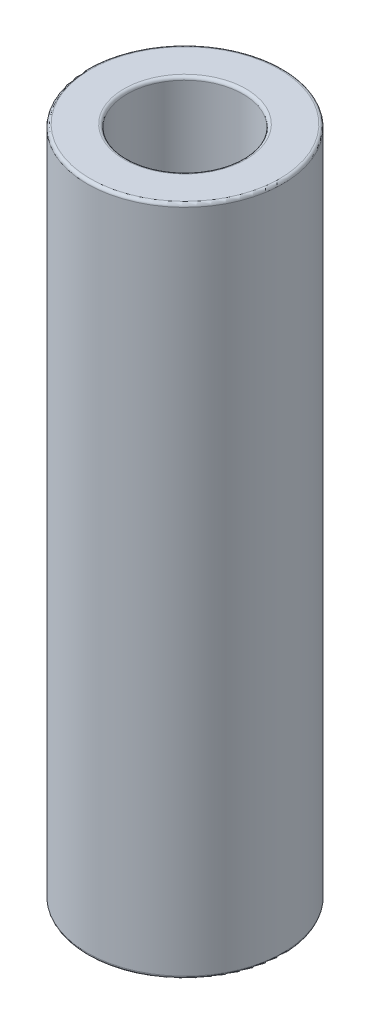
ISO-10303-21;
HEADER;
FILE_DESCRIPTION(('STEP AP214'),'2;1');
FILE_NAME('part.step','',(''),(''),'','','');
FILE_SCHEMA(('AUTOMOTIVE_DESIGN { 1 0 10303 214 1 1 1 1 }'));
ENDSEC;
DATA;
#1=APPLICATION_CONTEXT('core data for automotive mechanical design processes');
#2=APPLICATION_PROTOCOL_DEFINITION('international standard','automotive_design',2000,#1);
#3=PRODUCT_CONTEXT('',#1,'mechanical');
#4=PRODUCT('Part','Part','',(#3));
#5=PRODUCT_RELATED_PRODUCT_CATEGORY('part','',(#4));
#6=PRODUCT_DEFINITION_FORMATION('','',#4);
#7=PRODUCT_DEFINITION_CONTEXT('part definition',#1,'design');
#8=PRODUCT_DEFINITION('design','',#6,#7);
#9=PRODUCT_DEFINITION_SHAPE('','',#8);
#10=(LENGTH_UNIT() NAMED_UNIT(*) SI_UNIT(.MILLI.,.METRE.));
#11=(NAMED_UNIT(*) PLANE_ANGLE_UNIT() SI_UNIT($,.RADIAN.));
#12=(NAMED_UNIT(*) SI_UNIT($,.STERADIAN.) SOLID_ANGLE_UNIT());
#13=UNCERTAINTY_MEASURE_WITH_UNIT(LENGTH_MEASURE(1.E-05),#10,'distance_accuracy_value','');
#14=(GEOMETRIC_REPRESENTATION_CONTEXT(3) GLOBAL_UNCERTAINTY_ASSIGNED_CONTEXT((#13)) GLOBAL_UNIT_ASSIGNED_CONTEXT((#10,
#11,#12)) REPRESENTATION_CONTEXT('',''));
#15=CARTESIAN_POINT('',(0.,0.,0.));
#16=DIRECTION('',(0.,0.,1.));
#17=DIRECTION('',(1.,0.,0.));
#18=AXIS2_PLACEMENT_3D('',#15,#16,#17);
#19=CARTESIAN_POINT('',(0.,110.,0.));
#20=DIRECTION('',(0.,-1.,0.));
#21=DIRECTION('',(0.,0.,-1.));
#22=AXIS2_PLACEMENT_3D('',#19,#20,#21);
#23=CYLINDRICAL_SURFACE('',#22,9.5);
#24=CARTESIAN_POINT('',(0.,109.5,0.));
#25=DIRECTION('',(0.,1.,0.));
#26=DIRECTION('',(0.,0.,1.));
#27=AXIS2_PLACEMENT_3D('',#24,#25,#26);
#28=CIRCLE('',#27,9.5);
#29=CARTESIAN_POINT('',(0.,109.5,9.5));
#30=VERTEX_POINT('',#29);
#31=EDGE_CURVE('E48',#30,#30,#28,.T.);
#32=ORIENTED_EDGE('',*,*,#31,.T.);
#33=EDGE_LOOP('',(#32));
#34=FACE_BOUND('',#33,.T.);
#35=CARTESIAN_POINT('',(0.,0.5,0.));
#36=DIRECTION('',(0.,1.,0.));
#37=DIRECTION('',(0.,0.,1.));
#38=AXIS2_PLACEMENT_3D('',#35,#36,#37);
#39=CIRCLE('',#38,9.5);
#40=CARTESIAN_POINT('',(0.,0.5,9.5));
#41=VERTEX_POINT('',#40);
#42=EDGE_CURVE('E52',#41,#41,#39,.F.);
#43=ORIENTED_EDGE('',*,*,#42,.T.);
#44=EDGE_LOOP('',(#43));
#45=FACE_BOUND('',#44,.T.);
#46=ADVANCED_FACE('F37',(#34,#45),#23,.F.);
#47=CARTESIAN_POINT('',(0.,110.,0.));
#48=DIRECTION('',(0.,-1.,0.));
#49=DIRECTION('',(0.,0.,-1.));
#50=AXIS2_PLACEMENT_3D('',#47,#48,#49);
#51=CYLINDRICAL_SURFACE('',#50,16.);
#52=CARTESIAN_POINT('',(0.,109.5,0.));
#53=DIRECTION('',(0.,1.,0.));
#54=DIRECTION('',(0.,0.,1.));
#55=AXIS2_PLACEMENT_3D('',#52,#53,#54);
#56=CIRCLE('',#55,16.);
#57=CARTESIAN_POINT('',(0.,109.5,16.));
#58=VERTEX_POINT('',#57);
#59=EDGE_CURVE('E57',#58,#58,#56,.F.);
#60=ORIENTED_EDGE('',*,*,#59,.T.);
#61=EDGE_LOOP('',(#60));
#62=FACE_BOUND('',#61,.T.);
#63=CARTESIAN_POINT('',(0.,0.5,0.));
#64=DIRECTION('',(0.,1.,0.));
#65=DIRECTION('',(0.,0.,1.));
#66=AXIS2_PLACEMENT_3D('',#63,#64,#65);
#67=CIRCLE('',#66,16.);
#68=CARTESIAN_POINT('',(0.,0.5,16.));
#69=VERTEX_POINT('',#68);
#70=EDGE_CURVE('E60',#69,#69,#67,.T.);
#71=ORIENTED_EDGE('',*,*,#70,.T.);
#72=EDGE_LOOP('',(#71));
#73=FACE_BOUND('',#72,.T.);
#74=ADVANCED_FACE('F82',(#62,#73),#51,.T.);
#75=CARTESIAN_POINT('',(0.,110.,0.));
#76=DIRECTION('',(0.,1.,0.));
#77=DIRECTION('',(0.,0.,1.));
#78=AXIS2_PLACEMENT_3D('',#75,#76,#77);
#79=PLANE('',#78);
#80=CARTESIAN_POINT('',(0.,110.,0.));
#81=DIRECTION('',(0.,1.,0.));
#82=DIRECTION('',(0.,0.,1.));
#83=AXIS2_PLACEMENT_3D('',#80,#81,#82);
#84=CIRCLE('',#83,15.5);
#85=CARTESIAN_POINT('',(0.,110.,15.5));
#86=VERTEX_POINT('',#85);
#87=EDGE_CURVE('E63',#86,#86,#84,.T.);
#88=ORIENTED_EDGE('',*,*,#87,.T.);
#89=EDGE_LOOP('',(#88));
#90=FACE_BOUND('',#89,.T.);
#91=CARTESIAN_POINT('',(0.,110.,0.));
#92=DIRECTION('',(0.,1.,0.));
#93=DIRECTION('',(0.,0.,1.));
#94=AXIS2_PLACEMENT_3D('',#91,#92,#93);
#95=CIRCLE('',#94,10.);
#96=CARTESIAN_POINT('',(0.,110.,10.));
#97=VERTEX_POINT('',#96);
#98=EDGE_CURVE('E66',#97,#97,#95,.F.);
#99=ORIENTED_EDGE('',*,*,#98,.T.);
#100=EDGE_LOOP('',(#99));
#101=FACE_BOUND('',#100,.T.);
#102=ADVANCED_FACE('F70',(#90,#101),#79,.T.);
#103=CARTESIAN_POINT('',(0.,0.,0.));
#104=DIRECTION('',(0.,1.,0.));
#105=DIRECTION('',(0.,0.,1.));
#106=AXIS2_PLACEMENT_3D('',#103,#104,#105);
#107=PLANE('',#106);
#108=CARTESIAN_POINT('',(0.,0.,0.));
#109=DIRECTION('',(0.,1.,0.));
#110=DIRECTION('',(0.,0.,1.));
#111=AXIS2_PLACEMENT_3D('',#108,#109,#110);
#112=CIRCLE('',#111,15.5);
#113=CARTESIAN_POINT('',(0.,0.,15.5));
#114=VERTEX_POINT('',#113);
#115=EDGE_CURVE('E10',#114,#114,#112,.F.);
#116=ORIENTED_EDGE('',*,*,#115,.T.);
#117=EDGE_LOOP('',(#116));
#118=FACE_BOUND('',#117,.T.);
#119=CARTESIAN_POINT('',(0.,0.,0.));
#120=DIRECTION('',(0.,1.,0.));
#121=DIRECTION('',(0.,0.,1.));
#122=AXIS2_PLACEMENT_3D('',#119,#120,#121);
#123=CIRCLE('',#122,10.);
#124=CARTESIAN_POINT('',(0.,0.,10.));
#125=VERTEX_POINT('',#124);
#126=EDGE_CURVE('E44',#125,#125,#123,.T.);
#127=ORIENTED_EDGE('',*,*,#126,.T.);
#128=EDGE_LOOP('',(#127));
#129=FACE_BOUND('',#128,.T.);
#130=ADVANCED_FACE('F97',(#118,#129),#107,.F.);
#131=CARTESIAN_POINT('',(0.,109.5,0.));
#132=DIRECTION('',(0.,1.,0.));
#133=DIRECTION('',(0.,0.,1.));
#134=AXIS2_PLACEMENT_3D('',#131,#132,#133);
#135=TOROIDAL_SURFACE('',#134,15.5,0.5);
#136=ORIENTED_EDGE('',*,*,#59,.F.);
#137=EDGE_LOOP('',(#136));
#138=FACE_BOUND('',#137,.T.);
#139=ORIENTED_EDGE('',*,*,#87,.F.);
#140=EDGE_LOOP('',(#139));
#141=FACE_BOUND('',#140,.T.);
#142=ADVANCED_FACE('F76',(#138,#141),#135,.T.);
#143=CARTESIAN_POINT('',(0.,109.5,0.));
#144=DIRECTION('',(0.,1.,0.));
#145=DIRECTION('',(0.,0.,1.));
#146=AXIS2_PLACEMENT_3D('',#143,#144,#145);
#147=TOROIDAL_SURFACE('',#146,10.,0.5);
#148=ORIENTED_EDGE('',*,*,#98,.F.);
#149=EDGE_LOOP('',(#148));
#150=FACE_BOUND('',#149,.T.);
#151=ORIENTED_EDGE('',*,*,#31,.F.);
#152=EDGE_LOOP('',(#151));
#153=FACE_BOUND('',#152,.T.);
#154=ADVANCED_FACE('F72',(#150,#153),#147,.T.);
#155=CARTESIAN_POINT('',(0.,0.5,0.));
#156=DIRECTION('',(0.,1.,0.));
#157=DIRECTION('',(0.,0.,1.));
#158=AXIS2_PLACEMENT_3D('',#155,#156,#157);
#159=TOROIDAL_SURFACE('',#158,15.5,0.5);
#160=ORIENTED_EDGE('',*,*,#115,.F.);
#161=EDGE_LOOP('',(#160));
#162=FACE_BOUND('',#161,.T.);
#163=ORIENTED_EDGE('',*,*,#70,.F.);
#164=EDGE_LOOP('',(#163));
#165=FACE_BOUND('',#164,.T.);
#166=ADVANCED_FACE('F75',(#162,#165),#159,.T.);
#167=CARTESIAN_POINT('',(0.,0.5,0.));
#168=DIRECTION('',(0.,1.,0.));
#169=DIRECTION('',(0.,0.,1.));
#170=AXIS2_PLACEMENT_3D('',#167,#168,#169);
#171=TOROIDAL_SURFACE('',#170,10.,0.5);
#172=ORIENTED_EDGE('',*,*,#42,.F.);
#173=EDGE_LOOP('',(#172));
#174=FACE_BOUND('',#173,.T.);
#175=ORIENTED_EDGE('',*,*,#126,.F.);
#176=EDGE_LOOP('',(#175));
#177=FACE_BOUND('',#176,.T.);
#178=ADVANCED_FACE('F39',(#174,#177),#171,.T.);
#179=CLOSED_SHELL('',(#46,#74,#102,#130,#142,#154,#166,#178));
#180=MANIFOLD_SOLID_BREP('B2',#179);
#181=ADVANCED_BREP_SHAPE_REPRESENTATION('',(#18,#180),#14);
#182=SHAPE_DEFINITION_REPRESENTATION(#9,#181);
ENDSEC;
END-ISO-10303-21;
